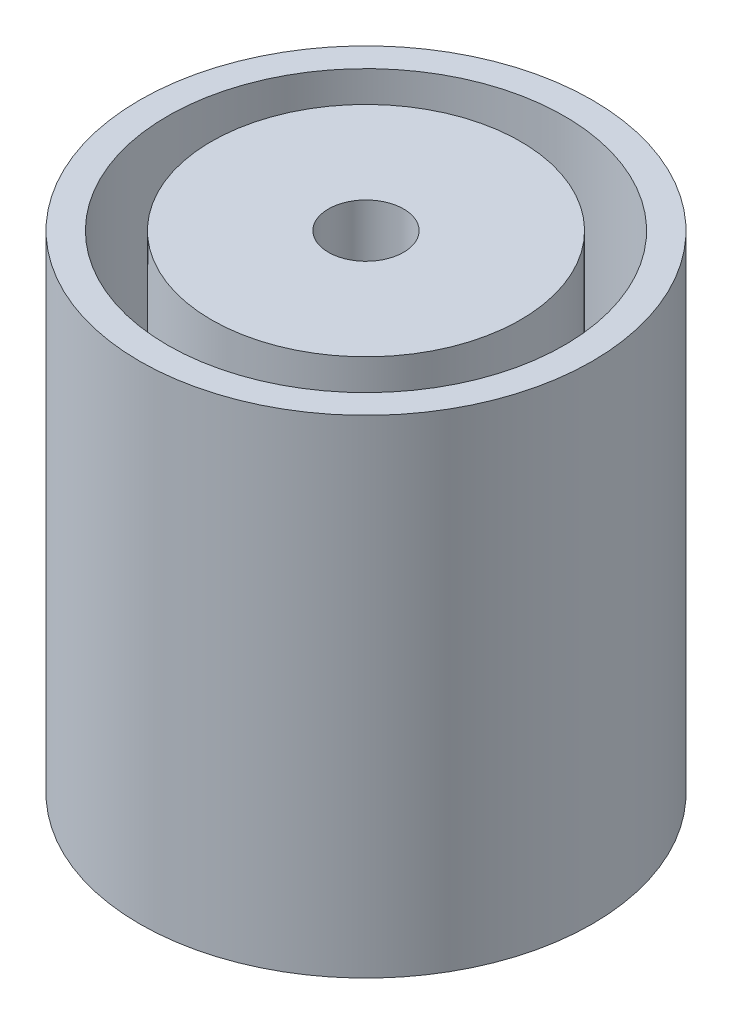
ISO-10303-21;
HEADER;
FILE_DESCRIPTION(('STEP AP214'),'2;1');
FILE_NAME('part.step','',(''),(''),'','','');
FILE_SCHEMA(('AUTOMOTIVE_DESIGN { 1 0 10303 214 1 1 1 1 }'));
ENDSEC;
DATA;
#1=APPLICATION_CONTEXT('core data for automotive mechanical design processes');
#2=APPLICATION_PROTOCOL_DEFINITION('international standard','automotive_design',2000,#1);
#3=PRODUCT_CONTEXT('',#1,'mechanical');
#4=PRODUCT('Part','Part','',(#3));
#5=PRODUCT_RELATED_PRODUCT_CATEGORY('part','',(#4));
#6=PRODUCT_DEFINITION_FORMATION('','',#4);
#7=PRODUCT_DEFINITION_CONTEXT('part definition',#1,'design');
#8=PRODUCT_DEFINITION('design','',#6,#7);
#9=PRODUCT_DEFINITION_SHAPE('','',#8);
#10=(LENGTH_UNIT() NAMED_UNIT(*) SI_UNIT(.MILLI.,.METRE.));
#11=(NAMED_UNIT(*) PLANE_ANGLE_UNIT() SI_UNIT($,.RADIAN.));
#12=(NAMED_UNIT(*) SI_UNIT($,.STERADIAN.) SOLID_ANGLE_UNIT());
#13=UNCERTAINTY_MEASURE_WITH_UNIT(LENGTH_MEASURE(1.E-05),#10,'distance_accuracy_value','');
#14=(GEOMETRIC_REPRESENTATION_CONTEXT(3) GLOBAL_UNCERTAINTY_ASSIGNED_CONTEXT((#13)) GLOBAL_UNIT_ASSIGNED_CONTEXT((#10,
#11,#12)) REPRESENTATION_CONTEXT('',''));
#15=CARTESIAN_POINT('',(0.,0.,0.));
#16=DIRECTION('',(0.,0.,1.));
#17=DIRECTION('',(1.,0.,0.));
#18=AXIS2_PLACEMENT_3D('',#15,#16,#17);
#19=CARTESIAN_POINT('',(0.,15.,0.));
#20=DIRECTION('',(0.,1.,0.));
#21=DIRECTION('',(0.,0.,1.));
#22=AXIS2_PLACEMENT_3D('',#19,#20,#21);
#23=PLANE('',#22);
#24=CARTESIAN_POINT('',(0.,15.,0.));
#25=DIRECTION('',(0.,1.,0.));
#26=DIRECTION('',(0.,0.,1.));
#27=AXIS2_PLACEMENT_3D('',#24,#25,#26);
#28=CIRCLE('',#27,14.25);
#29=CARTESIAN_POINT('',(0.,15.,14.25));
#30=VERTEX_POINT('',#29);
#31=EDGE_CURVE('E10',#30,#30,#28,.F.);
#32=ORIENTED_EDGE('',*,*,#31,.F.);
#33=EDGE_LOOP('',(#32));
#34=FACE_BOUND('',#33,.T.);
#35=CARTESIAN_POINT('',(0.,15.,0.));
#36=DIRECTION('',(0.,1.,0.));
#37=DIRECTION('',(0.,0.,1.));
#38=AXIS2_PLACEMENT_3D('',#35,#36,#37);
#39=CIRCLE('',#38,11.1);
#40=CARTESIAN_POINT('',(0.,15.,11.1));
#41=VERTEX_POINT('',#40);
#42=EDGE_CURVE('E53',#41,#41,#39,.T.);
#43=ORIENTED_EDGE('',*,*,#42,.F.);
#44=EDGE_LOOP('',(#43));
#45=FACE_BOUND('',#44,.T.);
#46=ADVANCED_FACE('F45',(#34,#45),#23,.T.);
#47=CARTESIAN_POINT('',(0.,35.,0.));
#48=DIRECTION('',(0.,-1.,0.));
#49=DIRECTION('',(0.,0.,-1.));
#50=AXIS2_PLACEMENT_3D('',#47,#48,#49);
#51=CYLINDRICAL_SURFACE('',#50,11.1);
#52=CARTESIAN_POINT('',(0.,35.,0.));
#53=DIRECTION('',(0.,1.,0.));
#54=DIRECTION('',(0.,0.,1.));
#55=AXIS2_PLACEMENT_3D('',#52,#53,#54);
#56=CIRCLE('',#55,11.1);
#57=CARTESIAN_POINT('',(0.,35.,11.1));
#58=VERTEX_POINT('',#57);
#59=EDGE_CURVE('E64',#58,#58,#56,.T.);
#60=ORIENTED_EDGE('',*,*,#59,.F.);
#61=EDGE_LOOP('',(#60));
#62=FACE_BOUND('',#61,.T.);
#63=ORIENTED_EDGE('',*,*,#42,.T.);
#64=EDGE_LOOP('',(#63));
#65=FACE_BOUND('',#64,.T.);
#66=ADVANCED_FACE('F98',(#62,#65),#51,.T.);
#67=CARTESIAN_POINT('',(0.,35.,0.));
#68=DIRECTION('',(0.,1.,0.));
#69=DIRECTION('',(0.,0.,1.));
#70=AXIS2_PLACEMENT_3D('',#67,#68,#69);
#71=PLANE('',#70);
#72=CARTESIAN_POINT('',(0.,35.,0.));
#73=DIRECTION('',(0.,1.,0.));
#74=DIRECTION('',(0.,0.,1.));
#75=AXIS2_PLACEMENT_3D('',#72,#73,#74);
#76=CIRCLE('',#75,2.7);
#77=CARTESIAN_POINT('',(0.,35.,2.7));
#78=VERTEX_POINT('',#77);
#79=EDGE_CURVE('E78',#78,#78,#76,.T.);
#80=ORIENTED_EDGE('',*,*,#79,.F.);
#81=EDGE_LOOP('',(#80));
#82=FACE_BOUND('',#81,.T.);
#83=ORIENTED_EDGE('',*,*,#59,.T.);
#84=EDGE_LOOP('',(#83));
#85=FACE_BOUND('',#84,.T.);
#86=ADVANCED_FACE('F94',(#82,#85),#71,.T.);
#87=CARTESIAN_POINT('',(0.,35.,0.));
#88=DIRECTION('',(0.,-1.,0.));
#89=DIRECTION('',(0.,0.,-1.));
#90=AXIS2_PLACEMENT_3D('',#87,#88,#89);
#91=CYLINDRICAL_SURFACE('',#90,14.25);
#92=CARTESIAN_POINT('',(0.,35.,0.));
#93=DIRECTION('',(0.,1.,0.));
#94=DIRECTION('',(0.,0.,1.));
#95=AXIS2_PLACEMENT_3D('',#92,#93,#94);
#96=CIRCLE('',#95,14.25);
#97=CARTESIAN_POINT('',(0.,35.,14.25));
#98=VERTEX_POINT('',#97);
#99=EDGE_CURVE('E73',#98,#98,#96,.T.);
#100=ORIENTED_EDGE('',*,*,#99,.T.);
#101=EDGE_LOOP('',(#100));
#102=FACE_BOUND('',#101,.T.);
#103=ORIENTED_EDGE('',*,*,#31,.T.);
#104=EDGE_LOOP('',(#103));
#105=FACE_BOUND('',#104,.T.);
#106=ADVANCED_FACE('F97',(#102,#105),#91,.F.);
#107=CARTESIAN_POINT('',(0.,35.,0.));
#108=DIRECTION('',(0.,1.,0.));
#109=DIRECTION('',(0.,0.,1.));
#110=AXIS2_PLACEMENT_3D('',#107,#108,#109);
#111=PLANE('',#110);
#112=ORIENTED_EDGE('',*,*,#99,.F.);
#113=EDGE_LOOP('',(#112));
#114=FACE_BOUND('',#113,.T.);
#115=CARTESIAN_POINT('',(0.,35.,0.));
#116=DIRECTION('',(0.,1.,0.));
#117=DIRECTION('',(0.,0.,1.));
#118=AXIS2_PLACEMENT_3D('',#115,#116,#117);
#119=CIRCLE('',#118,16.25);
#120=CARTESIAN_POINT('',(0.,35.,16.25));
#121=VERTEX_POINT('',#120);
#122=EDGE_CURVE('E69',#121,#121,#119,.T.);
#123=ORIENTED_EDGE('',*,*,#122,.T.);
#124=EDGE_LOOP('',(#123));
#125=FACE_BOUND('',#124,.T.);
#126=ADVANCED_FACE('F112',(#114,#125),#111,.T.);
#127=CARTESIAN_POINT('',(0.,0.,0.));
#128=DIRECTION('',(0.,1.,0.));
#129=DIRECTION('',(0.,0.,1.));
#130=AXIS2_PLACEMENT_3D('',#127,#128,#129);
#131=PLANE('',#130);
#132=CARTESIAN_POINT('',(0.,0.,0.));
#133=DIRECTION('',(0.,1.,0.));
#134=DIRECTION('',(0.,0.,1.));
#135=AXIS2_PLACEMENT_3D('',#132,#133,#134);
#136=CIRCLE('',#135,16.25);
#137=CARTESIAN_POINT('',(0.,0.,16.25));
#138=VERTEX_POINT('',#137);
#139=EDGE_CURVE('E58',#138,#138,#136,.T.);
#140=ORIENTED_EDGE('',*,*,#139,.F.);
#141=EDGE_LOOP('',(#140));
#142=FACE_BOUND('',#141,.T.);
#143=ADVANCED_FACE('F111',(#142),#131,.F.);
#144=CARTESIAN_POINT('',(0.,15.,0.));
#145=DIRECTION('',(0.,-1.,0.));
#146=DIRECTION('',(0.,0.,-1.));
#147=AXIS2_PLACEMENT_3D('',#144,#145,#146);
#148=CYLINDRICAL_SURFACE('',#147,16.25);
#149=ORIENTED_EDGE('',*,*,#139,.T.);
#150=EDGE_LOOP('',(#149));
#151=FACE_BOUND('',#150,.T.);
#152=ORIENTED_EDGE('',*,*,#122,.F.);
#153=EDGE_LOOP('',(#152));
#154=FACE_BOUND('',#153,.T.);
#155=ADVANCED_FACE('F47',(#151,#154),#148,.T.);
#156=CARTESIAN_POINT('',(0.,5.,0.));
#157=DIRECTION('',(0.,1.,0.));
#158=DIRECTION('',(0.,0.,1.));
#159=AXIS2_PLACEMENT_3D('',#156,#157,#158);
#160=CYLINDRICAL_SURFACE('',#159,2.7);
#161=CARTESIAN_POINT('',(0.,5.,0.));
#162=DIRECTION('',(0.,1.,0.));
#163=DIRECTION('',(0.,0.,1.));
#164=AXIS2_PLACEMENT_3D('',#161,#162,#163);
#165=CIRCLE('',#164,2.7);
#166=CARTESIAN_POINT('',(0.,5.,2.7));
#167=VERTEX_POINT('',#166);
#168=EDGE_CURVE('E77',#167,#167,#165,.T.);
#169=ORIENTED_EDGE('',*,*,#168,.F.);
#170=EDGE_LOOP('',(#169));
#171=FACE_BOUND('',#170,.T.);
#172=ORIENTED_EDGE('',*,*,#79,.T.);
#173=EDGE_LOOP('',(#172));
#174=FACE_BOUND('',#173,.T.);
#175=ADVANCED_FACE('F88',(#171,#174),#160,.F.);
#176=CARTESIAN_POINT('',(0.,5.,0.));
#177=DIRECTION('',(0.,1.,0.));
#178=DIRECTION('',(0.,0.,1.));
#179=AXIS2_PLACEMENT_3D('',#176,#177,#178);
#180=PLANE('',#179);
#181=ORIENTED_EDGE('',*,*,#168,.T.);
#182=EDGE_LOOP('',(#181));
#183=FACE_BOUND('',#182,.T.);
#184=ADVANCED_FACE('F86',(#183),#180,.T.);
#185=CLOSED_SHELL('',(#46,#66,#86,#106,#126,#143,#155,#175,#184));
#186=MANIFOLD_SOLID_BREP('B2',#185);
#187=ADVANCED_BREP_SHAPE_REPRESENTATION('',(#18,#186),#14);
#188=SHAPE_DEFINITION_REPRESENTATION(#9,#187);
ENDSEC;
END-ISO-10303-21;
